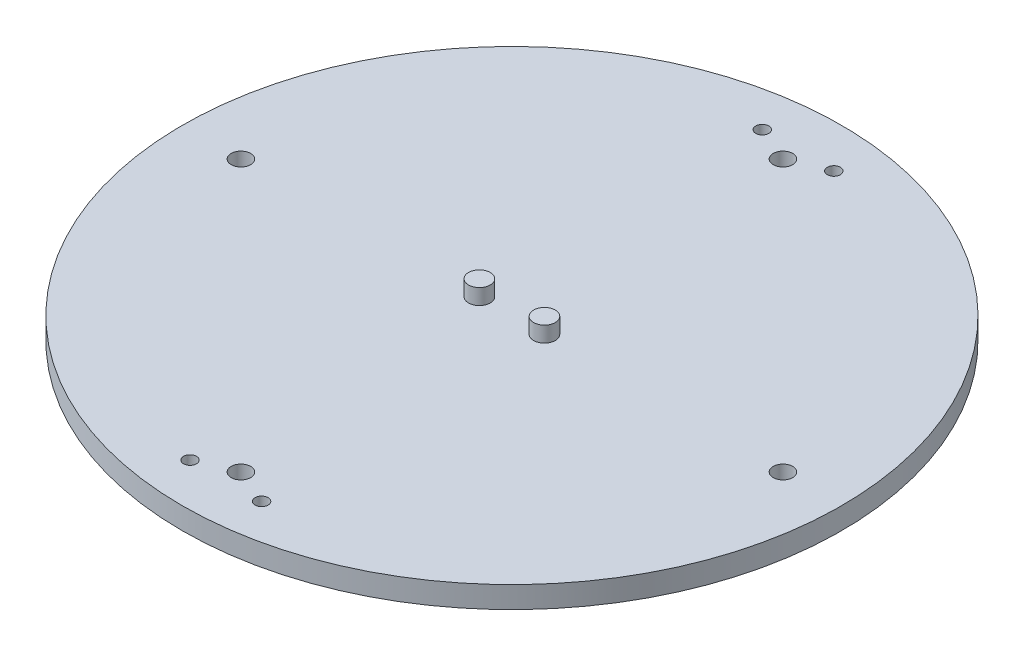
ISO-10303-21;
HEADER;
FILE_DESCRIPTION(('STEP AP214'),'2;1');
FILE_NAME('part.step','',(''),(''),'','','');
FILE_SCHEMA(('AUTOMOTIVE_DESIGN { 1 0 10303 214 1 1 1 1 }'));
ENDSEC;
DATA;
#1=APPLICATION_CONTEXT('core data for automotive mechanical design processes');
#2=APPLICATION_PROTOCOL_DEFINITION('international standard','automotive_design',2000,#1);
#3=PRODUCT_CONTEXT('',#1,'mechanical');
#4=PRODUCT('Part','Part','',(#3));
#5=PRODUCT_RELATED_PRODUCT_CATEGORY('part','',(#4));
#6=PRODUCT_DEFINITION_FORMATION('','',#4);
#7=PRODUCT_DEFINITION_CONTEXT('part definition',#1,'design');
#8=PRODUCT_DEFINITION('design','',#6,#7);
#9=PRODUCT_DEFINITION_SHAPE('','',#8);
#10=(LENGTH_UNIT() NAMED_UNIT(*) SI_UNIT(.MILLI.,.METRE.));
#11=(NAMED_UNIT(*) PLANE_ANGLE_UNIT() SI_UNIT($,.RADIAN.));
#12=(NAMED_UNIT(*) SI_UNIT($,.STERADIAN.) SOLID_ANGLE_UNIT());
#13=UNCERTAINTY_MEASURE_WITH_UNIT(LENGTH_MEASURE(1.E-05),#10,'distance_accuracy_value','');
#14=(GEOMETRIC_REPRESENTATION_CONTEXT(3) GLOBAL_UNCERTAINTY_ASSIGNED_CONTEXT((#13)) GLOBAL_UNIT_ASSIGNED_CONTEXT((#10,
#11,#12)) REPRESENTATION_CONTEXT('',''));
#15=CARTESIAN_POINT('',(0.,0.,0.));
#16=DIRECTION('',(0.,0.,1.));
#17=DIRECTION('',(1.,0.,0.));
#18=AXIS2_PLACEMENT_3D('',#15,#16,#17);
#19=CARTESIAN_POINT('',(0.,0.,0.));
#20=DIRECTION('',(0.,1.,0.));
#21=DIRECTION('',(0.,0.,1.));
#22=AXIS2_PLACEMENT_3D('',#19,#20,#21);
#23=PLANE('',#22);
#24=CARTESIAN_POINT('',(-8.25,0.,-65.97908543));
#25=DIRECTION('',(0.,1.,0.));
#26=DIRECTION('',(0.,0.,1.));
#27=AXIS2_PLACEMENT_3D('',#24,#25,#26);
#28=CIRCLE('',#27,1.5);
#29=CARTESIAN_POINT('',(-8.25,0.,-64.47908543));
#30=VERTEX_POINT('',#29);
#31=EDGE_CURVE('E308',#30,#30,#28,.T.);
#32=ORIENTED_EDGE('',*,*,#31,.T.);
#33=EDGE_LOOP('',(#32));
#34=FACE_BOUND('',#33,.T.);
#35=CARTESIAN_POINT('',(8.25,0.,-65.9790854299999));
#36=DIRECTION('',(0.,1.,0.));
#37=DIRECTION('',(0.,0.,1.));
#38=AXIS2_PLACEMENT_3D('',#35,#36,#37);
#39=CIRCLE('',#38,1.5);
#40=CARTESIAN_POINT('',(8.25,0.,-64.4790854299999));
#41=VERTEX_POINT('',#40);
#42=EDGE_CURVE('E312',#41,#41,#39,.F.);
#43=ORIENTED_EDGE('',*,*,#42,.F.);
#44=EDGE_LOOP('',(#43));
#45=FACE_BOUND('',#44,.T.);
#46=CARTESIAN_POINT('',(-8.25,0.,65.97908543));
#47=DIRECTION('',(0.,1.,0.));
#48=DIRECTION('',(0.,0.,1.));
#49=AXIS2_PLACEMENT_3D('',#46,#47,#48);
#50=CIRCLE('',#49,1.5);
#51=CARTESIAN_POINT('',(-8.25,0.,67.47908543));
#52=VERTEX_POINT('',#51);
#53=EDGE_CURVE('E316',#52,#52,#50,.F.);
#54=ORIENTED_EDGE('',*,*,#53,.F.);
#55=EDGE_LOOP('',(#54));
#56=FACE_BOUND('',#55,.T.);
#57=CARTESIAN_POINT('',(-7.50000000000001,0.,0.));
#58=DIRECTION('',(0.,1.,0.));
#59=DIRECTION('',(0.,0.,1.));
#60=AXIS2_PLACEMENT_3D('',#57,#58,#59);
#61=CIRCLE('',#60,2.5);
#62=CARTESIAN_POINT('',(-7.5,0.,2.5));
#63=VERTEX_POINT('',#62);
#64=CARTESIAN_POINT('',(-5.00000000000001,0.,0.));
#65=VERTEX_POINT('',#64);
#66=EDGE_CURVE('E125',#63,#65,#61,.T.);
#67=ORIENTED_EDGE('',*,*,#66,.T.);
#68=CARTESIAN_POINT('',(-7.50000000000001,0.,0.));
#69=DIRECTION('',(0.,1.,0.));
#70=DIRECTION('',(0.,0.,1.));
#71=AXIS2_PLACEMENT_3D('',#68,#69,#70);
#72=CIRCLE('',#71,2.5);
#73=CARTESIAN_POINT('',(-7.5,0.,-2.5));
#74=VERTEX_POINT('',#73);
#75=EDGE_CURVE('E145',#65,#74,#72,.T.);
#76=ORIENTED_EDGE('',*,*,#75,.T.);
#77=CARTESIAN_POINT('',(-7.5,0.,0.));
#78=DIRECTION('',(0.,1.,0.));
#79=DIRECTION('',(0.,0.,1.));
#80=AXIS2_PLACEMENT_3D('',#77,#78,#79);
#81=CIRCLE('',#80,2.5);
#82=CARTESIAN_POINT('',(-10.,0.,0.));
#83=VERTEX_POINT('',#82);
#84=EDGE_CURVE('E128',#74,#83,#81,.T.);
#85=ORIENTED_EDGE('',*,*,#84,.T.);
#86=CARTESIAN_POINT('',(-7.5,0.,0.));
#87=DIRECTION('',(0.,1.,0.));
#88=DIRECTION('',(0.,0.,1.));
#89=AXIS2_PLACEMENT_3D('',#86,#87,#88);
#90=CIRCLE('',#89,2.5);
#91=EDGE_CURVE('E122',#83,#63,#90,.T.);
#92=ORIENTED_EDGE('',*,*,#91,.T.);
#93=EDGE_LOOP('',(#67,#76,#85,#92));
#94=FACE_BOUND('',#93,.T.);
#95=CARTESIAN_POINT('',(7.49999999999999,0.,0.));
#96=DIRECTION('',(0.,1.,0.));
#97=DIRECTION('',(0.,0.,1.));
#98=AXIS2_PLACEMENT_3D('',#95,#96,#97);
#99=CIRCLE('',#98,2.5);
#100=CARTESIAN_POINT('',(4.99999999999999,0.,0.));
#101=VERTEX_POINT('',#100);
#102=CARTESIAN_POINT('',(7.49999999999999,0.,2.5));
#103=VERTEX_POINT('',#102);
#104=EDGE_CURVE('E255',#101,#103,#99,.T.);
#105=ORIENTED_EDGE('',*,*,#104,.T.);
#106=CARTESIAN_POINT('',(7.5,0.,0.));
#107=DIRECTION('',(0.,1.,0.));
#108=DIRECTION('',(0.,0.,1.));
#109=AXIS2_PLACEMENT_3D('',#106,#107,#108);
#110=CIRCLE('',#109,2.5);
#111=CARTESIAN_POINT('',(10.,0.,0.));
#112=VERTEX_POINT('',#111);
#113=EDGE_CURVE('E11',#103,#112,#110,.T.);
#114=ORIENTED_EDGE('',*,*,#113,.T.);
#115=CARTESIAN_POINT('',(7.5,0.,0.));
#116=DIRECTION('',(0.,1.,0.));
#117=DIRECTION('',(0.,0.,1.));
#118=AXIS2_PLACEMENT_3D('',#115,#116,#117);
#119=CIRCLE('',#118,2.5);
#120=CARTESIAN_POINT('',(7.49999999999999,0.,-2.5));
#121=VERTEX_POINT('',#120);
#122=EDGE_CURVE('E51',#112,#121,#119,.T.);
#123=ORIENTED_EDGE('',*,*,#122,.T.);
#124=CARTESIAN_POINT('',(7.49999999999999,0.,0.));
#125=DIRECTION('',(0.,1.,0.));
#126=DIRECTION('',(0.,0.,1.));
#127=AXIS2_PLACEMENT_3D('',#124,#125,#126);
#128=CIRCLE('',#127,2.5);
#129=EDGE_CURVE('E108',#121,#101,#128,.T.);
#130=ORIENTED_EDGE('',*,*,#129,.T.);
#131=EDGE_LOOP('',(#105,#114,#123,#130));
#132=FACE_BOUND('',#131,.T.);
#133=CARTESIAN_POINT('',(-62.5,0.,0.));
#134=DIRECTION('',(0.,1.,0.));
#135=DIRECTION('',(0.,0.,1.));
#136=AXIS2_PLACEMENT_3D('',#133,#134,#135);
#137=CIRCLE('',#136,2.25);
#138=CARTESIAN_POINT('',(-62.5,0.,2.25));
#139=VERTEX_POINT('',#138);
#140=EDGE_CURVE('E268',#139,#139,#137,.T.);
#141=ORIENTED_EDGE('',*,*,#140,.T.);
#142=EDGE_LOOP('',(#141));
#143=FACE_BOUND('',#142,.T.);
#144=CARTESIAN_POINT('',(0.,0.,-62.5));
#145=DIRECTION('',(0.,1.,0.));
#146=DIRECTION('',(0.,0.,1.));
#147=AXIS2_PLACEMENT_3D('',#144,#145,#146);
#148=CIRCLE('',#147,2.25);
#149=CARTESIAN_POINT('',(0.,0.,-60.25));
#150=VERTEX_POINT('',#149);
#151=EDGE_CURVE('E272',#150,#150,#148,.T.);
#152=ORIENTED_EDGE('',*,*,#151,.T.);
#153=EDGE_LOOP('',(#152));
#154=FACE_BOUND('',#153,.T.);
#155=CARTESIAN_POINT('',(62.5,0.,0.));
#156=DIRECTION('',(0.,1.,0.));
#157=DIRECTION('',(0.,0.,1.));
#158=AXIS2_PLACEMENT_3D('',#155,#156,#157);
#159=CIRCLE('',#158,2.25);
#160=CARTESIAN_POINT('',(62.5,0.,2.25));
#161=VERTEX_POINT('',#160);
#162=EDGE_CURVE('E280',#161,#161,#159,.T.);
#163=ORIENTED_EDGE('',*,*,#162,.T.);
#164=EDGE_LOOP('',(#163));
#165=FACE_BOUND('',#164,.T.);
#166=CARTESIAN_POINT('',(0.,0.,62.5));
#167=DIRECTION('',(0.,1.,0.));
#168=DIRECTION('',(0.,0.,1.));
#169=AXIS2_PLACEMENT_3D('',#166,#167,#168);
#170=CIRCLE('',#169,2.25);
#171=CARTESIAN_POINT('',(0.,0.,64.75));
#172=VERTEX_POINT('',#171);
#173=EDGE_CURVE('E241',#172,#172,#170,.T.);
#174=ORIENTED_EDGE('',*,*,#173,.T.);
#175=EDGE_LOOP('',(#174));
#176=FACE_BOUND('',#175,.T.);
#177=CARTESIAN_POINT('',(0.,0.,0.));
#178=DIRECTION('',(0.,1.,0.));
#179=DIRECTION('',(0.,0.,1.));
#180=AXIS2_PLACEMENT_3D('',#177,#178,#179);
#181=CIRCLE('',#180,76.);
#182=CARTESIAN_POINT('',(0.,0.,76.));
#183=VERTEX_POINT('',#182);
#184=EDGE_CURVE('E256',#183,#183,#181,.T.);
#185=ORIENTED_EDGE('',*,*,#184,.F.);
#186=EDGE_LOOP('',(#185));
#187=FACE_BOUND('',#186,.T.);
#188=CARTESIAN_POINT('',(8.25,0.,65.9790854299999));
#189=DIRECTION('',(0.,1.,0.));
#190=DIRECTION('',(0.,0.,1.));
#191=AXIS2_PLACEMENT_3D('',#188,#189,#190);
#192=CIRCLE('',#191,1.5);
#193=CARTESIAN_POINT('',(8.25,0.,67.4790854299999));
#194=VERTEX_POINT('',#193);
#195=EDGE_CURVE('E301',#194,#194,#192,.T.);
#196=ORIENTED_EDGE('',*,*,#195,.T.);
#197=EDGE_LOOP('',(#196));
#198=FACE_BOUND('',#197,.T.);
#199=ADVANCED_FACE('F40',(#34,#45,#56,#94,#132,#143,#154,#165,#176,#187,#198),#23,.F.);
#200=CARTESIAN_POINT('',(0.,5.,0.));
#201=DIRECTION('',(0.,1.,0.));
#202=DIRECTION('',(0.,0.,1.));
#203=AXIS2_PLACEMENT_3D('',#200,#201,#202);
#204=PLANE('',#203);
#205=CARTESIAN_POINT('',(8.25,5.,-65.9790854299999));
#206=DIRECTION('',(0.,1.,0.));
#207=DIRECTION('',(0.,0.,1.));
#208=AXIS2_PLACEMENT_3D('',#205,#206,#207);
#209=CIRCLE('',#208,1.5);
#210=CARTESIAN_POINT('',(8.25,5.,-64.4790854299999));
#211=VERTEX_POINT('',#210);
#212=EDGE_CURVE('E329',#211,#211,#209,.F.);
#213=ORIENTED_EDGE('',*,*,#212,.T.);
#214=EDGE_LOOP('',(#213));
#215=FACE_BOUND('',#214,.T.);
#216=CARTESIAN_POINT('',(-8.25,5.,65.97908543));
#217=DIRECTION('',(0.,1.,0.));
#218=DIRECTION('',(0.,0.,1.));
#219=AXIS2_PLACEMENT_3D('',#216,#217,#218);
#220=CIRCLE('',#219,1.5);
#221=CARTESIAN_POINT('',(-8.25,5.,67.47908543));
#222=VERTEX_POINT('',#221);
#223=EDGE_CURVE('E320',#222,#222,#220,.F.);
#224=ORIENTED_EDGE('',*,*,#223,.T.);
#225=EDGE_LOOP('',(#224));
#226=FACE_BOUND('',#225,.T.);
#227=CARTESIAN_POINT('',(7.5,5.,0.));
#228=DIRECTION('',(0.,1.,0.));
#229=DIRECTION('',(0.,0.,1.));
#230=AXIS2_PLACEMENT_3D('',#227,#228,#229);
#231=CIRCLE('',#230,2.5);
#232=CARTESIAN_POINT('',(7.5,5.,2.5));
#233=VERTEX_POINT('',#232);
#234=EDGE_CURVE('E297',#233,#233,#231,.T.);
#235=ORIENTED_EDGE('',*,*,#234,.F.);
#236=EDGE_LOOP('',(#235));
#237=FACE_BOUND('',#236,.T.);
#238=CARTESIAN_POINT('',(-7.5,5.,0.));
#239=DIRECTION('',(0.,1.,0.));
#240=DIRECTION('',(0.,0.,1.));
#241=AXIS2_PLACEMENT_3D('',#238,#239,#240);
#242=CIRCLE('',#241,2.5);
#243=CARTESIAN_POINT('',(-7.5,5.,2.5));
#244=VERTEX_POINT('',#243);
#245=EDGE_CURVE('E289',#244,#244,#242,.T.);
#246=ORIENTED_EDGE('',*,*,#245,.F.);
#247=EDGE_LOOP('',(#246));
#248=FACE_BOUND('',#247,.T.);
#249=CARTESIAN_POINT('',(-62.5,5.,0.));
#250=DIRECTION('',(0.,1.,0.));
#251=DIRECTION('',(0.,0.,1.));
#252=AXIS2_PLACEMENT_3D('',#249,#250,#251);
#253=CIRCLE('',#252,2.25);
#254=CARTESIAN_POINT('',(-62.5,5.,2.25));
#255=VERTEX_POINT('',#254);
#256=EDGE_CURVE('E260',#255,#255,#253,.T.);
#257=ORIENTED_EDGE('',*,*,#256,.F.);
#258=EDGE_LOOP('',(#257));
#259=FACE_BOUND('',#258,.T.);
#260=CARTESIAN_POINT('',(0.,5.,-62.5));
#261=DIRECTION('',(0.,1.,0.));
#262=DIRECTION('',(0.,0.,1.));
#263=AXIS2_PLACEMENT_3D('',#260,#261,#262);
#264=CIRCLE('',#263,2.25);
#265=CARTESIAN_POINT('',(0.,5.,-60.25));
#266=VERTEX_POINT('',#265);
#267=EDGE_CURVE('E276',#266,#266,#264,.T.);
#268=ORIENTED_EDGE('',*,*,#267,.F.);
#269=EDGE_LOOP('',(#268));
#270=FACE_BOUND('',#269,.T.);
#271=CARTESIAN_POINT('',(62.5,5.,0.));
#272=DIRECTION('',(0.,1.,0.));
#273=DIRECTION('',(0.,0.,1.));
#274=AXIS2_PLACEMENT_3D('',#271,#272,#273);
#275=CIRCLE('',#274,2.25);
#276=CARTESIAN_POINT('',(62.5,5.,2.25));
#277=VERTEX_POINT('',#276);
#278=EDGE_CURVE('E247',#277,#277,#275,.T.);
#279=ORIENTED_EDGE('',*,*,#278,.F.);
#280=EDGE_LOOP('',(#279));
#281=FACE_BOUND('',#280,.T.);
#282=CARTESIAN_POINT('',(0.,5.,62.5));
#283=DIRECTION('',(0.,1.,0.));
#284=DIRECTION('',(0.,0.,1.));
#285=AXIS2_PLACEMENT_3D('',#282,#283,#284);
#286=CIRCLE('',#285,2.25);
#287=CARTESIAN_POINT('',(0.,5.,64.75));
#288=VERTEX_POINT('',#287);
#289=EDGE_CURVE('E238',#288,#288,#286,.T.);
#290=ORIENTED_EDGE('',*,*,#289,.F.);
#291=EDGE_LOOP('',(#290));
#292=FACE_BOUND('',#291,.T.);
#293=CARTESIAN_POINT('',(0.,5.,0.));
#294=DIRECTION('',(0.,1.,0.));
#295=DIRECTION('',(0.,0.,1.));
#296=AXIS2_PLACEMENT_3D('',#293,#294,#295);
#297=CIRCLE('',#296,76.);
#298=CARTESIAN_POINT('',(0.,5.,76.));
#299=VERTEX_POINT('',#298);
#300=EDGE_CURVE('E251',#299,#299,#297,.T.);
#301=ORIENTED_EDGE('',*,*,#300,.T.);
#302=EDGE_LOOP('',(#301));
#303=FACE_BOUND('',#302,.T.);
#304=CARTESIAN_POINT('',(-8.25,5.,-65.97908543));
#305=DIRECTION('',(0.,1.,0.));
#306=DIRECTION('',(0.,0.,1.));
#307=AXIS2_PLACEMENT_3D('',#304,#305,#306);
#308=CIRCLE('',#307,1.5);
#309=CARTESIAN_POINT('',(-8.25,5.,-64.47908543));
#310=VERTEX_POINT('',#309);
#311=EDGE_CURVE('E325',#310,#310,#308,.T.);
#312=ORIENTED_EDGE('',*,*,#311,.F.);
#313=EDGE_LOOP('',(#312));
#314=FACE_BOUND('',#313,.T.);
#315=CARTESIAN_POINT('',(8.25,5.,65.9790854299999));
#316=DIRECTION('',(0.,1.,0.));
#317=DIRECTION('',(0.,0.,1.));
#318=AXIS2_PLACEMENT_3D('',#315,#316,#317);
#319=CIRCLE('',#318,1.5);
#320=CARTESIAN_POINT('',(8.25,5.,67.4790854299999));
#321=VERTEX_POINT('',#320);
#322=EDGE_CURVE('E324',#321,#321,#319,.T.);
#323=ORIENTED_EDGE('',*,*,#322,.F.);
#324=EDGE_LOOP('',(#323));
#325=FACE_BOUND('',#324,.T.);
#326=ADVANCED_FACE('F337',(#215,#226,#237,#248,#259,#270,#281,#292,#303,#314,#325),#204,.T.);
#327=CARTESIAN_POINT('',(0.,5.,0.));
#328=DIRECTION('',(0.,-1.,0.));
#329=DIRECTION('',(0.,0.,-1.));
#330=AXIS2_PLACEMENT_3D('',#327,#328,#329);
#331=CYLINDRICAL_SURFACE('',#330,76.);
#332=ORIENTED_EDGE('',*,*,#300,.F.);
#333=EDGE_LOOP('',(#332));
#334=FACE_BOUND('',#333,.T.);
#335=ORIENTED_EDGE('',*,*,#184,.T.);
#336=EDGE_LOOP('',(#335));
#337=FACE_BOUND('',#336,.T.);
#338=ADVANCED_FACE('F394',(#334,#337),#331,.T.);
#339=CARTESIAN_POINT('',(0.,5.,62.5));
#340=DIRECTION('',(0.,-1.,0.));
#341=DIRECTION('',(0.,0.,-1.));
#342=AXIS2_PLACEMENT_3D('',#339,#340,#341);
#343=CYLINDRICAL_SURFACE('',#342,2.25);
#344=ORIENTED_EDGE('',*,*,#289,.T.);
#345=EDGE_LOOP('',(#344));
#346=FACE_BOUND('',#345,.T.);
#347=ORIENTED_EDGE('',*,*,#173,.F.);
#348=EDGE_LOOP('',(#347));
#349=FACE_BOUND('',#348,.T.);
#350=ADVANCED_FACE('F391',(#346,#349),#343,.F.);
#351=CARTESIAN_POINT('',(62.5,5.,0.));
#352=DIRECTION('',(0.,-1.,0.));
#353=DIRECTION('',(0.,0.,-1.));
#354=AXIS2_PLACEMENT_3D('',#351,#352,#353);
#355=CYLINDRICAL_SURFACE('',#354,2.25);
#356=ORIENTED_EDGE('',*,*,#278,.T.);
#357=EDGE_LOOP('',(#356));
#358=FACE_BOUND('',#357,.T.);
#359=ORIENTED_EDGE('',*,*,#162,.F.);
#360=EDGE_LOOP('',(#359));
#361=FACE_BOUND('',#360,.T.);
#362=ADVANCED_FACE('F387',(#358,#361),#355,.F.);
#363=CARTESIAN_POINT('',(0.,5.,-62.5));
#364=DIRECTION('',(0.,-1.,0.));
#365=DIRECTION('',(0.,0.,-1.));
#366=AXIS2_PLACEMENT_3D('',#363,#364,#365);
#367=CYLINDRICAL_SURFACE('',#366,2.25);
#368=ORIENTED_EDGE('',*,*,#267,.T.);
#369=EDGE_LOOP('',(#368));
#370=FACE_BOUND('',#369,.T.);
#371=ORIENTED_EDGE('',*,*,#151,.F.);
#372=EDGE_LOOP('',(#371));
#373=FACE_BOUND('',#372,.T.);
#374=ADVANCED_FACE('F383',(#370,#373),#367,.F.);
#375=CARTESIAN_POINT('',(-62.5,5.,0.));
#376=DIRECTION('',(0.,-1.,0.));
#377=DIRECTION('',(0.,0.,-1.));
#378=AXIS2_PLACEMENT_3D('',#375,#376,#377);
#379=CYLINDRICAL_SURFACE('',#378,2.25);
#380=ORIENTED_EDGE('',*,*,#256,.T.);
#381=EDGE_LOOP('',(#380));
#382=FACE_BOUND('',#381,.T.);
#383=ORIENTED_EDGE('',*,*,#140,.F.);
#384=EDGE_LOOP('',(#383));
#385=FACE_BOUND('',#384,.T.);
#386=ADVANCED_FACE('F380',(#382,#385),#379,.F.);
#387=CARTESIAN_POINT('',(-7.5,-20.,0.));
#388=DIRECTION('',(0.,1.,0.));
#389=DIRECTION('',(0.,0.,1.));
#390=AXIS2_PLACEMENT_3D('',#387,#388,#389);
#391=CYLINDRICAL_SURFACE('',#390,2.5);
#392=DIRECTION('',(0.,1.,0.));
#393=VECTOR('',#392,1.);
#394=CARTESIAN_POINT('',(-10.,-20.,0.));
#395=LINE('',#394,#393);
#396=CARTESIAN_POINT('',(-10.,-10.,0.));
#397=VERTEX_POINT('',#396);
#398=EDGE_CURVE('E44',#83,#397,#395,.F.);
#399=ORIENTED_EDGE('',*,*,#398,.F.);
#400=ORIENTED_EDGE('',*,*,#84,.F.);
#401=DIRECTION('',(0.,1.,0.));
#402=VECTOR('',#401,1.);
#403=CARTESIAN_POINT('',(-7.5,-20.,-2.5));
#404=LINE('',#403,#402);
#405=CARTESIAN_POINT('',(-7.5,-10.,-2.5));
#406=VERTEX_POINT('',#405);
#407=EDGE_CURVE('E232',#406,#74,#404,.T.);
#408=ORIENTED_EDGE('',*,*,#407,.F.);
#409=CARTESIAN_POINT('',(-7.5,-10.,0.));
#410=DIRECTION('',(0.,-1.,0.));
#411=DIRECTION('',(0.,0.,-1.));
#412=AXIS2_PLACEMENT_3D('',#409,#410,#411);
#413=CIRCLE('',#412,2.5);
#414=EDGE_CURVE('E229',#397,#406,#413,.T.);
#415=ORIENTED_EDGE('',*,*,#414,.F.);
#416=EDGE_LOOP('',(#399,#400,#408,#415));
#417=FACE_BOUND('',#416,.T.);
#418=ADVANCED_FACE('F42',(#417),#391,.T.);
#419=CARTESIAN_POINT('',(-7.5,-20.,0.));
#420=DIRECTION('',(0.,1.,0.));
#421=DIRECTION('',(0.,0.,1.));
#422=AXIS2_PLACEMENT_3D('',#419,#420,#421);
#423=CYLINDRICAL_SURFACE('',#422,2.5);
#424=ORIENTED_EDGE('',*,*,#91,.F.);
#425=ORIENTED_EDGE('',*,*,#398,.T.);
#426=CARTESIAN_POINT('',(-7.5,-10.,0.));
#427=DIRECTION('',(0.,-1.,0.));
#428=DIRECTION('',(0.,0.,-1.));
#429=AXIS2_PLACEMENT_3D('',#426,#427,#428);
#430=CIRCLE('',#429,2.5);
#431=CARTESIAN_POINT('',(-7.5,-10.,2.5));
#432=VERTEX_POINT('',#431);
#433=EDGE_CURVE('E135',#432,#397,#430,.T.);
#434=ORIENTED_EDGE('',*,*,#433,.F.);
#435=DIRECTION('',(0.,1.,0.));
#436=VECTOR('',#435,1.);
#437=CARTESIAN_POINT('',(-7.5,-20.,2.5));
#438=LINE('',#437,#436);
#439=EDGE_CURVE('E132',#63,#432,#438,.F.);
#440=ORIENTED_EDGE('',*,*,#439,.F.);
#441=EDGE_LOOP('',(#424,#425,#434,#440));
#442=FACE_BOUND('',#441,.T.);
#443=ADVANCED_FACE('F133',(#442),#423,.T.);
#444=CARTESIAN_POINT('',(-7.50000000000001,0.,0.));
#445=DIRECTION('',(0.,1.,0.));
#446=DIRECTION('',(-1.,0.,0.));
#447=AXIS2_PLACEMENT_3D('',#444,#445,#446);
#448=CYLINDRICAL_SURFACE('',#447,2.5);
#449=ORIENTED_EDGE('',*,*,#407,.T.);
#450=ORIENTED_EDGE('',*,*,#75,.F.);
#451=DIRECTION('',(0.,1.,0.));
#452=VECTOR('',#451,1.);
#453=CARTESIAN_POINT('',(-5.00000000000001,0.,0.));
#454=LINE('',#453,#452);
#455=CARTESIAN_POINT('',(-5.,-10.,0.));
#456=VERTEX_POINT('',#455);
#457=EDGE_CURVE('E140',#456,#65,#454,.T.);
#458=ORIENTED_EDGE('',*,*,#457,.F.);
#459=CARTESIAN_POINT('',(-7.5,-10.,0.));
#460=DIRECTION('',(0.,-1.,0.));
#461=DIRECTION('',(0.,0.,-1.));
#462=AXIS2_PLACEMENT_3D('',#459,#460,#461);
#463=CIRCLE('',#462,2.5);
#464=EDGE_CURVE('E209',#406,#456,#463,.T.);
#465=ORIENTED_EDGE('',*,*,#464,.F.);
#466=EDGE_LOOP('',(#449,#450,#458,#465));
#467=FACE_BOUND('',#466,.T.);
#468=ADVANCED_FACE('F440',(#467),#448,.T.);
#469=CARTESIAN_POINT('',(0.,-10.,0.));
#470=DIRECTION('',(0.,0.,1.));
#471=DIRECTION('',(1.,0.,0.));
#472=AXIS2_PLACEMENT_3D('',#469,#470,#471);
#473=TOROIDAL_SURFACE('',#472,7.5,2.5);
#474=CARTESIAN_POINT('',(0.,-17.5,0.));
#475=DIRECTION('',(1.,0.,0.));
#476=DIRECTION('',(0.,0.,-1.));
#477=AXIS2_PLACEMENT_3D('',#474,#475,#476);
#478=CIRCLE('',#477,2.5);
#479=CARTESIAN_POINT('',(0.,-20.,0.));
#480=VERTEX_POINT('',#479);
#481=CARTESIAN_POINT('',(0.,-17.5,-2.5));
#482=VERTEX_POINT('',#481);
#483=EDGE_CURVE('E102',#480,#482,#478,.T.);
#484=ORIENTED_EDGE('',*,*,#483,.F.);
#485=CARTESIAN_POINT('',(0.,-10.,0.));
#486=DIRECTION('',(0.,0.,1.));
#487=DIRECTION('',(1.,0.,0.));
#488=AXIS2_PLACEMENT_3D('',#485,#486,#487);
#489=CIRCLE('',#488,10.);
#490=EDGE_CURVE('E217',#397,#480,#489,.T.);
#491=ORIENTED_EDGE('',*,*,#490,.F.);
#492=ORIENTED_EDGE('',*,*,#414,.T.);
#493=CARTESIAN_POINT('',(0.,-10.,-2.5));
#494=DIRECTION('',(0.,0.,1.));
#495=DIRECTION('',(1.,0.,0.));
#496=AXIS2_PLACEMENT_3D('',#493,#494,#495);
#497=CIRCLE('',#496,7.5);
#498=EDGE_CURVE('E205',#482,#406,#497,.F.);
#499=ORIENTED_EDGE('',*,*,#498,.F.);
#500=EDGE_LOOP('',(#484,#491,#492,#499));
#501=FACE_BOUND('',#500,.T.);
#502=ADVANCED_FACE('F436',(#501),#473,.T.);
#503=CARTESIAN_POINT('',(0.,-10.,0.));
#504=DIRECTION('',(0.,0.,1.));
#505=DIRECTION('',(1.,0.,0.));
#506=AXIS2_PLACEMENT_3D('',#503,#504,#505);
#507=TOROIDAL_SURFACE('',#506,7.5,2.5);
#508=CARTESIAN_POINT('',(0.,-10.,0.));
#509=DIRECTION('',(0.,0.,1.));
#510=DIRECTION('',(1.,0.,0.));
#511=AXIS2_PLACEMENT_3D('',#508,#509,#510);
#512=CIRCLE('',#511,10.);
#513=CARTESIAN_POINT('',(10.,-10.,0.));
#514=VERTEX_POINT('',#513);
#515=EDGE_CURVE('E224',#480,#514,#512,.T.);
#516=ORIENTED_EDGE('',*,*,#515,.F.);
#517=ORIENTED_EDGE('',*,*,#483,.T.);
#518=CARTESIAN_POINT('',(0.,-10.,-2.5));
#519=DIRECTION('',(0.,0.,1.));
#520=DIRECTION('',(1.,0.,0.));
#521=AXIS2_PLACEMENT_3D('',#518,#519,#520);
#522=CIRCLE('',#521,7.5);
#523=CARTESIAN_POINT('',(7.5,-9.99999999999999,-2.5));
#524=VERTEX_POINT('',#523);
#525=EDGE_CURVE('E201',#524,#482,#522,.F.);
#526=ORIENTED_EDGE('',*,*,#525,.F.);
#527=CARTESIAN_POINT('',(7.5,-10.,0.));
#528=DIRECTION('',(0.,1.,0.));
#529=DIRECTION('',(0.,0.,1.));
#530=AXIS2_PLACEMENT_3D('',#527,#528,#529);
#531=CIRCLE('',#530,2.5);
#532=EDGE_CURVE('E197',#514,#524,#531,.T.);
#533=ORIENTED_EDGE('',*,*,#532,.F.);
#534=EDGE_LOOP('',(#516,#517,#526,#533));
#535=FACE_BOUND('',#534,.T.);
#536=ADVANCED_FACE('F432',(#535),#507,.T.);
#537=CARTESIAN_POINT('',(0.,-10.,0.));
#538=DIRECTION('',(0.,0.,-1.));
#539=DIRECTION('',(-1.,0.,0.));
#540=AXIS2_PLACEMENT_3D('',#537,#538,#539);
#541=TOROIDAL_SURFACE('',#540,7.5,2.5);
#542=CARTESIAN_POINT('',(0.,-17.5,0.));
#543=DIRECTION('',(-1.,0.,0.));
#544=DIRECTION('',(0.,0.,1.));
#545=AXIS2_PLACEMENT_3D('',#542,#543,#544);
#546=CIRCLE('',#545,2.5);
#547=CARTESIAN_POINT('',(0.,-17.5,2.5));
#548=VERTEX_POINT('',#547);
#549=EDGE_CURVE('E221',#480,#548,#546,.T.);
#550=ORIENTED_EDGE('',*,*,#549,.F.);
#551=ORIENTED_EDGE('',*,*,#515,.T.);
#552=CARTESIAN_POINT('',(7.5,-10.,0.));
#553=DIRECTION('',(0.,1.,0.));
#554=DIRECTION('',(0.,0.,1.));
#555=AXIS2_PLACEMENT_3D('',#552,#553,#554);
#556=CIRCLE('',#555,2.5);
#557=CARTESIAN_POINT('',(7.5,-9.99999999999999,2.5));
#558=VERTEX_POINT('',#557);
#559=EDGE_CURVE('E189',#558,#514,#556,.T.);
#560=ORIENTED_EDGE('',*,*,#559,.F.);
#561=CARTESIAN_POINT('',(0.,-10.,2.5));
#562=DIRECTION('',(0.,0.,-1.));
#563=DIRECTION('',(-1.,0.,0.));
#564=AXIS2_PLACEMENT_3D('',#561,#562,#563);
#565=CIRCLE('',#564,7.5);
#566=EDGE_CURVE('E185',#548,#558,#565,.F.);
#567=ORIENTED_EDGE('',*,*,#566,.F.);
#568=EDGE_LOOP('',(#550,#551,#560,#567));
#569=FACE_BOUND('',#568,.T.);
#570=ADVANCED_FACE('F428',(#569),#541,.T.);
#571=CARTESIAN_POINT('',(0.,-10.,0.));
#572=DIRECTION('',(0.,0.,-1.));
#573=DIRECTION('',(-1.,0.,0.));
#574=AXIS2_PLACEMENT_3D('',#571,#572,#573);
#575=TOROIDAL_SURFACE('',#574,7.5,2.5);
#576=ORIENTED_EDGE('',*,*,#490,.T.);
#577=ORIENTED_EDGE('',*,*,#549,.T.);
#578=CARTESIAN_POINT('',(0.,-10.,2.5));
#579=DIRECTION('',(0.,0.,-1.));
#580=DIRECTION('',(-1.,0.,0.));
#581=AXIS2_PLACEMENT_3D('',#578,#579,#580);
#582=CIRCLE('',#581,7.5);
#583=EDGE_CURVE('E181',#432,#548,#582,.F.);
#584=ORIENTED_EDGE('',*,*,#583,.F.);
#585=ORIENTED_EDGE('',*,*,#433,.T.);
#586=EDGE_LOOP('',(#576,#577,#584,#585));
#587=FACE_BOUND('',#586,.T.);
#588=ADVANCED_FACE('F425',(#587),#575,.T.);
#589=CARTESIAN_POINT('',(-7.49999999999999,-20.,0.));
#590=DIRECTION('',(0.,1.,0.));
#591=DIRECTION('',(-1.,0.,0.));
#592=AXIS2_PLACEMENT_3D('',#589,#590,#591);
#593=CYLINDRICAL_SURFACE('',#592,2.5);
#594=ORIENTED_EDGE('',*,*,#66,.F.);
#595=ORIENTED_EDGE('',*,*,#439,.T.);
#596=CARTESIAN_POINT('',(-7.5,-10.,0.));
#597=DIRECTION('',(0.,-1.,0.));
#598=DIRECTION('',(0.,0.,-1.));
#599=AXIS2_PLACEMENT_3D('',#596,#597,#598);
#600=CIRCLE('',#599,2.5);
#601=EDGE_CURVE('E177',#456,#432,#600,.T.);
#602=ORIENTED_EDGE('',*,*,#601,.F.);
#603=ORIENTED_EDGE('',*,*,#457,.T.);
#604=EDGE_LOOP('',(#594,#595,#602,#603));
#605=FACE_BOUND('',#604,.T.);
#606=ADVANCED_FACE('F143',(#605),#593,.T.);
#607=CARTESIAN_POINT('',(0.,-10.,0.));
#608=DIRECTION('',(0.,0.,1.));
#609=DIRECTION('',(1.,0.,0.));
#610=AXIS2_PLACEMENT_3D('',#607,#608,#609);
#611=TOROIDAL_SURFACE('',#610,7.5,2.5);
#612=ORIENTED_EDGE('',*,*,#498,.T.);
#613=ORIENTED_EDGE('',*,*,#464,.T.);
#614=CARTESIAN_POINT('',(0.,-10.,0.));
#615=DIRECTION('',(0.,0.,1.));
#616=DIRECTION('',(1.,0.,0.));
#617=AXIS2_PLACEMENT_3D('',#614,#615,#616);
#618=CIRCLE('',#617,5.);
#619=CARTESIAN_POINT('',(5.,-10.,0.));
#620=VERTEX_POINT('',#619);
#621=EDGE_CURVE('E173',#620,#456,#618,.F.);
#622=ORIENTED_EDGE('',*,*,#621,.F.);
#623=CARTESIAN_POINT('',(7.5,-9.99999999999999,0.));
#624=DIRECTION('',(0.,1.,0.));
#625=DIRECTION('',(-1.,0.,0.));
#626=AXIS2_PLACEMENT_3D('',#623,#624,#625);
#627=CIRCLE('',#626,2.5);
#628=EDGE_CURVE('E169',#524,#620,#627,.T.);
#629=ORIENTED_EDGE('',*,*,#628,.F.);
#630=ORIENTED_EDGE('',*,*,#525,.T.);
#631=EDGE_LOOP('',(#612,#613,#622,#629,#630));
#632=FACE_BOUND('',#631,.T.);
#633=ADVANCED_FACE('F418',(#632),#611,.T.);
#634=CARTESIAN_POINT('',(7.5,-20.,0.));
#635=DIRECTION('',(0.,1.,0.));
#636=DIRECTION('',(0.,0.,1.));
#637=AXIS2_PLACEMENT_3D('',#634,#635,#636);
#638=CYLINDRICAL_SURFACE('',#637,2.5);
#639=DIRECTION('',(0.,1.,0.));
#640=VECTOR('',#639,1.);
#641=CARTESIAN_POINT('',(7.5,-20.,-2.5));
#642=LINE('',#641,#640);
#643=EDGE_CURVE('E165',#121,#524,#642,.F.);
#644=ORIENTED_EDGE('',*,*,#643,.F.);
#645=ORIENTED_EDGE('',*,*,#122,.F.);
#646=DIRECTION('',(0.,1.,0.));
#647=VECTOR('',#646,1.);
#648=CARTESIAN_POINT('',(10.,-20.,0.));
#649=LINE('',#648,#647);
#650=EDGE_CURVE('E193',#514,#112,#649,.T.);
#651=ORIENTED_EDGE('',*,*,#650,.F.);
#652=ORIENTED_EDGE('',*,*,#532,.T.);
#653=EDGE_LOOP('',(#644,#645,#651,#652));
#654=FACE_BOUND('',#653,.T.);
#655=ADVANCED_FACE('F414',(#654),#638,.T.);
#656=CARTESIAN_POINT('',(7.5,-20.,0.));
#657=DIRECTION('',(0.,1.,0.));
#658=DIRECTION('',(0.,0.,1.));
#659=AXIS2_PLACEMENT_3D('',#656,#657,#658);
#660=CYLINDRICAL_SURFACE('',#659,2.5);
#661=ORIENTED_EDGE('',*,*,#650,.T.);
#662=ORIENTED_EDGE('',*,*,#113,.F.);
#663=DIRECTION('',(0.,1.,0.));
#664=VECTOR('',#663,1.);
#665=CARTESIAN_POINT('',(7.5,-20.,2.5));
#666=LINE('',#665,#664);
#667=EDGE_CURVE('E162',#558,#103,#666,.T.);
#668=ORIENTED_EDGE('',*,*,#667,.F.);
#669=ORIENTED_EDGE('',*,*,#559,.T.);
#670=EDGE_LOOP('',(#661,#662,#668,#669));
#671=FACE_BOUND('',#670,.T.);
#672=ADVANCED_FACE('F410',(#671),#660,.T.);
#673=CARTESIAN_POINT('',(0.,-10.,0.));
#674=DIRECTION('',(0.,0.,-1.));
#675=DIRECTION('',(-1.,0.,0.));
#676=AXIS2_PLACEMENT_3D('',#673,#674,#675);
#677=TOROIDAL_SURFACE('',#676,7.5,2.5);
#678=ORIENTED_EDGE('',*,*,#583,.T.);
#679=ORIENTED_EDGE('',*,*,#566,.T.);
#680=CARTESIAN_POINT('',(7.5,-10.,0.));
#681=DIRECTION('',(0.,1.,0.));
#682=DIRECTION('',(0.,0.,1.));
#683=AXIS2_PLACEMENT_3D('',#680,#681,#682);
#684=CIRCLE('',#683,2.5);
#685=EDGE_CURVE('E157',#620,#558,#684,.T.);
#686=ORIENTED_EDGE('',*,*,#685,.F.);
#687=ORIENTED_EDGE('',*,*,#621,.T.);
#688=ORIENTED_EDGE('',*,*,#601,.T.);
#689=EDGE_LOOP('',(#678,#679,#686,#687,#688));
#690=FACE_BOUND('',#689,.T.);
#691=ADVANCED_FACE('F406',(#690),#677,.T.);
#692=CARTESIAN_POINT('',(7.50000000000001,-20.,0.));
#693=DIRECTION('',(0.,-1.,0.));
#694=DIRECTION('',(1.,0.,0.));
#695=AXIS2_PLACEMENT_3D('',#692,#693,#694);
#696=CYLINDRICAL_SURFACE('',#695,2.5);
#697=ORIENTED_EDGE('',*,*,#643,.T.);
#698=ORIENTED_EDGE('',*,*,#628,.T.);
#699=DIRECTION('',(0.,1.,0.));
#700=VECTOR('',#699,1.);
#701=CARTESIAN_POINT('',(5.,-10.,0.));
#702=LINE('',#701,#700);
#703=EDGE_CURVE('E153',#101,#620,#702,.F.);
#704=ORIENTED_EDGE('',*,*,#703,.F.);
#705=ORIENTED_EDGE('',*,*,#129,.F.);
#706=EDGE_LOOP('',(#697,#698,#704,#705));
#707=FACE_BOUND('',#706,.T.);
#708=ADVANCED_FACE('F402',(#707),#696,.T.);
#709=CARTESIAN_POINT('',(7.49999999999999,0.,0.));
#710=DIRECTION('',(0.,-1.,0.));
#711=DIRECTION('',(1.,0.,0.));
#712=AXIS2_PLACEMENT_3D('',#709,#710,#711);
#713=CYLINDRICAL_SURFACE('',#712,2.5);
#714=ORIENTED_EDGE('',*,*,#685,.T.);
#715=ORIENTED_EDGE('',*,*,#667,.T.);
#716=ORIENTED_EDGE('',*,*,#104,.F.);
#717=ORIENTED_EDGE('',*,*,#703,.T.);
#718=EDGE_LOOP('',(#714,#715,#716,#717));
#719=FACE_BOUND('',#718,.T.);
#720=ADVANCED_FACE('F378',(#719),#713,.T.);
#721=CARTESIAN_POINT('',(-7.5,8.6,0.));
#722=DIRECTION('',(0.,-1.,0.));
#723=DIRECTION('',(0.,0.,-1.));
#724=AXIS2_PLACEMENT_3D('',#721,#722,#723);
#725=CYLINDRICAL_SURFACE('',#724,2.5);
#726=ORIENTED_EDGE('',*,*,#245,.T.);
#727=EDGE_LOOP('',(#726));
#728=FACE_BOUND('',#727,.T.);
#729=CARTESIAN_POINT('',(-7.50000000000001,8.6,0.));
#730=DIRECTION('',(0.,1.,0.));
#731=DIRECTION('',(0.,0.,1.));
#732=AXIS2_PLACEMENT_3D('',#729,#730,#731);
#733=CIRCLE('',#732,2.5);
#734=CARTESIAN_POINT('',(-7.50000000000001,8.6,2.5));
#735=VERTEX_POINT('',#734);
#736=EDGE_CURVE('E158',#735,#735,#733,.T.);
#737=ORIENTED_EDGE('',*,*,#736,.F.);
#738=EDGE_LOOP('',(#737));
#739=FACE_BOUND('',#738,.T.);
#740=ADVANCED_FACE('F374',(#728,#739),#725,.T.);
#741=CARTESIAN_POINT('',(-7.50000000000001,8.6,0.));
#742=DIRECTION('',(0.,1.,0.));
#743=DIRECTION('',(0.,0.,1.));
#744=AXIS2_PLACEMENT_3D('',#741,#742,#743);
#745=PLANE('',#744);
#746=ORIENTED_EDGE('',*,*,#736,.T.);
#747=EDGE_LOOP('',(#746));
#748=FACE_BOUND('',#747,.T.);
#749=ADVANCED_FACE('F370',(#748),#745,.T.);
#750=CARTESIAN_POINT('',(7.5,8.6,0.));
#751=DIRECTION('',(0.,-1.,0.));
#752=DIRECTION('',(0.,0.,-1.));
#753=AXIS2_PLACEMENT_3D('',#750,#751,#752);
#754=CYLINDRICAL_SURFACE('',#753,2.5);
#755=ORIENTED_EDGE('',*,*,#234,.T.);
#756=EDGE_LOOP('',(#755));
#757=FACE_BOUND('',#756,.T.);
#758=CARTESIAN_POINT('',(7.5,8.6,0.));
#759=DIRECTION('',(0.,1.,0.));
#760=DIRECTION('',(0.,0.,1.));
#761=AXIS2_PLACEMENT_3D('',#758,#759,#760);
#762=CIRCLE('',#761,2.5);
#763=CARTESIAN_POINT('',(7.5,8.6,2.5));
#764=VERTEX_POINT('',#763);
#765=EDGE_CURVE('E293',#764,#764,#762,.T.);
#766=ORIENTED_EDGE('',*,*,#765,.F.);
#767=EDGE_LOOP('',(#766));
#768=FACE_BOUND('',#767,.T.);
#769=ADVANCED_FACE('F361',(#757,#768),#754,.T.);
#770=CARTESIAN_POINT('',(7.5,8.6,0.));
#771=DIRECTION('',(0.,1.,0.));
#772=DIRECTION('',(0.,0.,1.));
#773=AXIS2_PLACEMENT_3D('',#770,#771,#772);
#774=PLANE('',#773);
#775=ORIENTED_EDGE('',*,*,#765,.T.);
#776=EDGE_LOOP('',(#775));
#777=FACE_BOUND('',#776,.T.);
#778=ADVANCED_FACE('F355',(#777),#774,.T.);
#779=CARTESIAN_POINT('',(-8.25,-25.,65.97908543));
#780=DIRECTION('',(0.,1.,0.));
#781=DIRECTION('',(0.,0.,1.));
#782=AXIS2_PLACEMENT_3D('',#779,#780,#781);
#783=CYLINDRICAL_SURFACE('',#782,1.5);
#784=ORIENTED_EDGE('',*,*,#223,.F.);
#785=EDGE_LOOP('',(#784));
#786=FACE_BOUND('',#785,.T.);
#787=ORIENTED_EDGE('',*,*,#53,.T.);
#788=EDGE_LOOP('',(#787));
#789=FACE_BOUND('',#788,.T.);
#790=ADVANCED_FACE('F344',(#786,#789),#783,.F.);
#791=CARTESIAN_POINT('',(8.25,-25.,-65.9790854299999));
#792=DIRECTION('',(0.,1.,0.));
#793=DIRECTION('',(0.,0.,1.));
#794=AXIS2_PLACEMENT_3D('',#791,#792,#793);
#795=CYLINDRICAL_SURFACE('',#794,1.5);
#796=ORIENTED_EDGE('',*,*,#212,.F.);
#797=EDGE_LOOP('',(#796));
#798=FACE_BOUND('',#797,.T.);
#799=ORIENTED_EDGE('',*,*,#42,.T.);
#800=EDGE_LOOP('',(#799));
#801=FACE_BOUND('',#800,.T.);
#802=ADVANCED_FACE('F340',(#798,#801),#795,.F.);
#803=CARTESIAN_POINT('',(-8.25,-25.,-65.97908543));
#804=DIRECTION('',(0.,1.,0.));
#805=DIRECTION('',(0.,0.,1.));
#806=AXIS2_PLACEMENT_3D('',#803,#804,#805);
#807=CYLINDRICAL_SURFACE('',#806,1.5);
#808=ORIENTED_EDGE('',*,*,#311,.T.);
#809=EDGE_LOOP('',(#808));
#810=FACE_BOUND('',#809,.T.);
#811=ORIENTED_EDGE('',*,*,#31,.F.);
#812=EDGE_LOOP('',(#811));
#813=FACE_BOUND('',#812,.T.);
#814=ADVANCED_FACE('F343',(#810,#813),#807,.F.);
#815=CARTESIAN_POINT('',(8.25,-25.,65.9790854299999));
#816=DIRECTION('',(0.,1.,0.));
#817=DIRECTION('',(0.,0.,1.));
#818=AXIS2_PLACEMENT_3D('',#815,#816,#817);
#819=CYLINDRICAL_SURFACE('',#818,1.5);
#820=ORIENTED_EDGE('',*,*,#322,.T.);
#821=EDGE_LOOP('',(#820));
#822=FACE_BOUND('',#821,.T.);
#823=ORIENTED_EDGE('',*,*,#195,.F.);
#824=EDGE_LOOP('',(#823));
#825=FACE_BOUND('',#824,.T.);
#826=ADVANCED_FACE('F471',(#822,#825),#819,.F.);
#827=CLOSED_SHELL('',(#199,#326,#338,#350,#362,#374,#386,#418,#443,#468,#502,#536,#570,#588,
#606,#633,#655,#672,#691,#708,#720,#740,#749,#769,#778,#790,#802,#814,#826));
#828=MANIFOLD_SOLID_BREP('B2',#827);
#829=ADVANCED_BREP_SHAPE_REPRESENTATION('',(#18,#828),#14);
#830=SHAPE_DEFINITION_REPRESENTATION(#9,#829);
ENDSEC;
END-ISO-10303-21;
